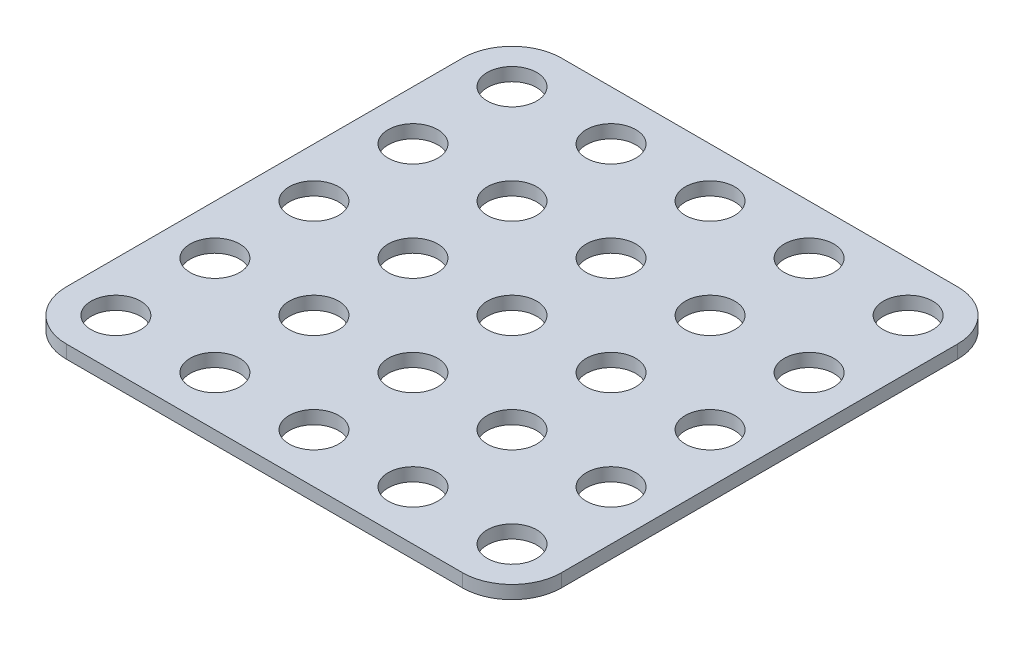
ISO-10303-21;
HEADER;
FILE_DESCRIPTION(('STEP AP214'),'2;1');
FILE_NAME('part.step','',(''),(''),'','','');
FILE_SCHEMA(('AUTOMOTIVE_DESIGN { 1 0 10303 214 1 1 1 1 }'));
ENDSEC;
DATA;
#1=APPLICATION_CONTEXT('core data for automotive mechanical design processes');
#2=APPLICATION_PROTOCOL_DEFINITION('international standard','automotive_design',2000,#1);
#3=PRODUCT_CONTEXT('',#1,'mechanical');
#4=PRODUCT('Part','Part','',(#3));
#5=PRODUCT_RELATED_PRODUCT_CATEGORY('part','',(#4));
#6=PRODUCT_DEFINITION_FORMATION('','',#4);
#7=PRODUCT_DEFINITION_CONTEXT('part definition',#1,'design');
#8=PRODUCT_DEFINITION('design','',#6,#7);
#9=PRODUCT_DEFINITION_SHAPE('','',#8);
#10=(LENGTH_UNIT() NAMED_UNIT(*) SI_UNIT(.MILLI.,.METRE.));
#11=(NAMED_UNIT(*) PLANE_ANGLE_UNIT() SI_UNIT($,.RADIAN.));
#12=(NAMED_UNIT(*) SI_UNIT($,.STERADIAN.) SOLID_ANGLE_UNIT());
#13=UNCERTAINTY_MEASURE_WITH_UNIT(LENGTH_MEASURE(1.E-05),#10,'distance_accuracy_value','');
#14=(GEOMETRIC_REPRESENTATION_CONTEXT(3) GLOBAL_UNCERTAINTY_ASSIGNED_CONTEXT((#13)) GLOBAL_UNIT_ASSIGNED_CONTEXT((#10,
#11,#12)) REPRESENTATION_CONTEXT('',''));
#15=CARTESIAN_POINT('',(0.,0.,0.));
#16=DIRECTION('',(0.,0.,1.));
#17=DIRECTION('',(1.,0.,0.));
#18=AXIS2_PLACEMENT_3D('',#15,#16,#17);
#19=CARTESIAN_POINT('',(75.,4.,0.));
#20=DIRECTION('',(-1.,0.,0.));
#21=DIRECTION('',(0.,0.,1.));
#22=AXIS2_PLACEMENT_3D('',#19,#20,#21);
#23=PLANE('',#22);
#24=DIRECTION('',(0.,0.,-1.));
#25=VECTOR('',#24,1.);
#26=CARTESIAN_POINT('',(75.,0.,0.));
#27=LINE('',#26,#25);
#28=CARTESIAN_POINT('',(75.,0.,60.));
#29=VERTEX_POINT('',#28);
#30=CARTESIAN_POINT('',(75.,0.,-60.));
#31=VERTEX_POINT('',#30);
#32=EDGE_CURVE('E248',#29,#31,#27,.T.);
#33=ORIENTED_EDGE('',*,*,#32,.T.);
#34=DIRECTION('',(0.,-1.,0.));
#35=VECTOR('',#34,1.);
#36=CARTESIAN_POINT('',(75.,4.,-60.));
#37=LINE('',#36,#35);
#38=CARTESIAN_POINT('',(75.,4.,-60.));
#39=VERTEX_POINT('',#38);
#40=EDGE_CURVE('E11',#39,#31,#37,.T.);
#41=ORIENTED_EDGE('',*,*,#40,.F.);
#42=DIRECTION('',(0.,0.,-1.));
#43=VECTOR('',#42,1.);
#44=CARTESIAN_POINT('',(75.,4.,0.));
#45=LINE('',#44,#43);
#46=CARTESIAN_POINT('',(75.,4.,60.));
#47=VERTEX_POINT('',#46);
#48=EDGE_CURVE('E310',#47,#39,#45,.T.);
#49=ORIENTED_EDGE('',*,*,#48,.F.);
#50=DIRECTION('',(0.,-1.,0.));
#51=VECTOR('',#50,1.);
#52=CARTESIAN_POINT('',(75.,4.,60.));
#53=LINE('',#52,#51);
#54=EDGE_CURVE('E63',#47,#29,#53,.T.);
#55=ORIENTED_EDGE('',*,*,#54,.T.);
#56=EDGE_LOOP('',(#33,#41,#49,#55));
#57=FACE_BOUND('',#56,.T.);
#58=ADVANCED_FACE('F45',(#57),#23,.F.);
#59=CARTESIAN_POINT('',(60.,4.,-60.));
#60=DIRECTION('',(0.,-1.,0.));
#61=DIRECTION('',(0.,0.,-1.));
#62=AXIS2_PLACEMENT_3D('',#59,#60,#61);
#63=CYLINDRICAL_SURFACE('',#62,15.);
#64=CARTESIAN_POINT('',(60.,0.,-60.));
#65=DIRECTION('',(0.,1.,0.));
#66=DIRECTION('',(0.,0.,1.));
#67=AXIS2_PLACEMENT_3D('',#64,#65,#66);
#68=CIRCLE('',#67,15.);
#69=CARTESIAN_POINT('',(60.,0.,-75.));
#70=VERTEX_POINT('',#69);
#71=EDGE_CURVE('E251',#31,#70,#68,.T.);
#72=ORIENTED_EDGE('',*,*,#71,.T.);
#73=DIRECTION('',(0.,-1.,0.));
#74=VECTOR('',#73,1.);
#75=CARTESIAN_POINT('',(60.,4.,-75.));
#76=LINE('',#75,#74);
#77=CARTESIAN_POINT('',(60.,4.,-75.));
#78=VERTEX_POINT('',#77);
#79=EDGE_CURVE('E55',#78,#70,#76,.T.);
#80=ORIENTED_EDGE('',*,*,#79,.F.);
#81=CARTESIAN_POINT('',(60.,4.,-60.));
#82=DIRECTION('',(0.,1.,0.));
#83=DIRECTION('',(0.,0.,1.));
#84=AXIS2_PLACEMENT_3D('',#81,#82,#83);
#85=CIRCLE('',#84,15.);
#86=EDGE_CURVE('E102',#39,#78,#85,.T.);
#87=ORIENTED_EDGE('',*,*,#86,.F.);
#88=ORIENTED_EDGE('',*,*,#40,.T.);
#89=EDGE_LOOP('',(#72,#80,#87,#88));
#90=FACE_BOUND('',#89,.T.);
#91=ADVANCED_FACE('F295',(#90),#63,.T.);
#92=CARTESIAN_POINT('',(0.,4.,-75.));
#93=DIRECTION('',(0.,0.,-1.));
#94=DIRECTION('',(-1.,0.,0.));
#95=AXIS2_PLACEMENT_3D('',#92,#93,#94);
#96=PLANE('',#95);
#97=DIRECTION('',(1.,0.,0.));
#98=VECTOR('',#97,1.);
#99=CARTESIAN_POINT('',(0.,0.,-75.));
#100=LINE('',#99,#98);
#101=CARTESIAN_POINT('',(-60.,0.,-75.));
#102=VERTEX_POINT('',#101);
#103=EDGE_CURVE('E255',#102,#70,#100,.T.);
#104=ORIENTED_EDGE('',*,*,#103,.F.);
#105=DIRECTION('',(0.,-1.,0.));
#106=VECTOR('',#105,1.);
#107=CARTESIAN_POINT('',(-60.,4.,-75.));
#108=LINE('',#107,#106);
#109=CARTESIAN_POINT('',(-60.,4.,-75.));
#110=VERTEX_POINT('',#109);
#111=EDGE_CURVE('E286',#110,#102,#108,.T.);
#112=ORIENTED_EDGE('',*,*,#111,.F.);
#113=DIRECTION('',(1.,0.,0.));
#114=VECTOR('',#113,1.);
#115=CARTESIAN_POINT('',(0.,4.,-75.));
#116=LINE('',#115,#114);
#117=EDGE_CURVE('E294',#110,#78,#116,.T.);
#118=ORIENTED_EDGE('',*,*,#117,.T.);
#119=ORIENTED_EDGE('',*,*,#79,.T.);
#120=EDGE_LOOP('',(#104,#112,#118,#119));
#121=FACE_BOUND('',#120,.T.);
#122=ADVANCED_FACE('F292',(#121),#96,.T.);
#123=CARTESIAN_POINT('',(-60.,4.,-60.));
#124=DIRECTION('',(0.,-1.,0.));
#125=DIRECTION('',(0.,0.,-1.));
#126=AXIS2_PLACEMENT_3D('',#123,#124,#125);
#127=CYLINDRICAL_SURFACE('',#126,15.);
#128=CARTESIAN_POINT('',(-60.,0.,-60.));
#129=DIRECTION('',(0.,1.,0.));
#130=DIRECTION('',(0.,0.,1.));
#131=AXIS2_PLACEMENT_3D('',#128,#129,#130);
#132=CIRCLE('',#131,15.);
#133=CARTESIAN_POINT('',(-75.,0.,-60.));
#134=VERTEX_POINT('',#133);
#135=EDGE_CURVE('E259',#134,#102,#132,.F.);
#136=ORIENTED_EDGE('',*,*,#135,.F.);
#137=DIRECTION('',(0.,-1.,0.));
#138=VECTOR('',#137,1.);
#139=CARTESIAN_POINT('',(-75.,4.,-60.));
#140=LINE('',#139,#138);
#141=CARTESIAN_POINT('',(-75.,4.,-60.));
#142=VERTEX_POINT('',#141);
#143=EDGE_CURVE('E283',#142,#134,#140,.T.);
#144=ORIENTED_EDGE('',*,*,#143,.F.);
#145=CARTESIAN_POINT('',(-60.,4.,-60.));
#146=DIRECTION('',(0.,1.,0.));
#147=DIRECTION('',(0.,0.,1.));
#148=AXIS2_PLACEMENT_3D('',#145,#146,#147);
#149=CIRCLE('',#148,15.);
#150=EDGE_CURVE('E304',#142,#110,#149,.F.);
#151=ORIENTED_EDGE('',*,*,#150,.T.);
#152=ORIENTED_EDGE('',*,*,#111,.T.);
#153=EDGE_LOOP('',(#136,#144,#151,#152));
#154=FACE_BOUND('',#153,.T.);
#155=ADVANCED_FACE('F302',(#154),#127,.T.);
#156=CARTESIAN_POINT('',(-75.,4.,0.));
#157=DIRECTION('',(-1.,0.,0.));
#158=DIRECTION('',(0.,0.,1.));
#159=AXIS2_PLACEMENT_3D('',#156,#157,#158);
#160=PLANE('',#159);
#161=DIRECTION('',(0.,0.,-1.));
#162=VECTOR('',#161,1.);
#163=CARTESIAN_POINT('',(-75.,0.,0.));
#164=LINE('',#163,#162);
#165=CARTESIAN_POINT('',(-75.,0.,60.));
#166=VERTEX_POINT('',#165);
#167=EDGE_CURVE('E263',#166,#134,#164,.T.);
#168=ORIENTED_EDGE('',*,*,#167,.F.);
#169=DIRECTION('',(0.,-1.,0.));
#170=VECTOR('',#169,1.);
#171=CARTESIAN_POINT('',(-75.,4.,60.));
#172=LINE('',#171,#170);
#173=CARTESIAN_POINT('',(-75.,4.,60.));
#174=VERTEX_POINT('',#173);
#175=EDGE_CURVE('E138',#174,#166,#172,.T.);
#176=ORIENTED_EDGE('',*,*,#175,.F.);
#177=DIRECTION('',(0.,0.,-1.));
#178=VECTOR('',#177,1.);
#179=CARTESIAN_POINT('',(-75.,4.,0.));
#180=LINE('',#179,#178);
#181=EDGE_CURVE('E126',#174,#142,#180,.T.);
#182=ORIENTED_EDGE('',*,*,#181,.T.);
#183=ORIENTED_EDGE('',*,*,#143,.T.);
#184=EDGE_LOOP('',(#168,#176,#182,#183));
#185=FACE_BOUND('',#184,.T.);
#186=ADVANCED_FACE('F315',(#185),#160,.T.);
#187=CARTESIAN_POINT('',(-60.,4.,60.));
#188=DIRECTION('',(0.,-1.,0.));
#189=DIRECTION('',(0.,0.,-1.));
#190=AXIS2_PLACEMENT_3D('',#187,#188,#189);
#191=CYLINDRICAL_SURFACE('',#190,15.);
#192=CARTESIAN_POINT('',(-60.,0.,60.));
#193=DIRECTION('',(0.,1.,0.));
#194=DIRECTION('',(0.,0.,1.));
#195=AXIS2_PLACEMENT_3D('',#192,#193,#194);
#196=CIRCLE('',#195,15.);
#197=CARTESIAN_POINT('',(-60.,0.,75.));
#198=VERTEX_POINT('',#197);
#199=EDGE_CURVE('E134',#166,#198,#196,.T.);
#200=ORIENTED_EDGE('',*,*,#199,.T.);
#201=DIRECTION('',(0.,-1.,0.));
#202=VECTOR('',#201,1.);
#203=CARTESIAN_POINT('',(-60.,4.,75.));
#204=LINE('',#203,#202);
#205=CARTESIAN_POINT('',(-60.,4.,75.));
#206=VERTEX_POINT('',#205);
#207=EDGE_CURVE('E131',#206,#198,#204,.T.);
#208=ORIENTED_EDGE('',*,*,#207,.F.);
#209=CARTESIAN_POINT('',(-60.,4.,60.));
#210=DIRECTION('',(0.,1.,0.));
#211=DIRECTION('',(0.,0.,1.));
#212=AXIS2_PLACEMENT_3D('',#209,#210,#211);
#213=CIRCLE('',#212,15.);
#214=EDGE_CURVE('E118',#174,#206,#213,.T.);
#215=ORIENTED_EDGE('',*,*,#214,.F.);
#216=ORIENTED_EDGE('',*,*,#175,.T.);
#217=EDGE_LOOP('',(#200,#208,#215,#216));
#218=FACE_BOUND('',#217,.T.);
#219=ADVANCED_FACE('F132',(#218),#191,.T.);
#220=CARTESIAN_POINT('',(0.,4.,75.));
#221=DIRECTION('',(0.,0.,-1.));
#222=DIRECTION('',(-1.,0.,0.));
#223=AXIS2_PLACEMENT_3D('',#220,#221,#222);
#224=PLANE('',#223);
#225=DIRECTION('',(1.,0.,0.));
#226=VECTOR('',#225,1.);
#227=CARTESIAN_POINT('',(0.,0.,75.));
#228=LINE('',#227,#226);
#229=CARTESIAN_POINT('',(60.,0.,75.));
#230=VERTEX_POINT('',#229);
#231=EDGE_CURVE('E269',#198,#230,#228,.T.);
#232=ORIENTED_EDGE('',*,*,#231,.T.);
#233=DIRECTION('',(0.,-1.,0.));
#234=VECTOR('',#233,1.);
#235=CARTESIAN_POINT('',(60.,4.,75.));
#236=LINE('',#235,#234);
#237=CARTESIAN_POINT('',(60.,4.,75.));
#238=VERTEX_POINT('',#237);
#239=EDGE_CURVE('E90',#238,#230,#236,.T.);
#240=ORIENTED_EDGE('',*,*,#239,.F.);
#241=DIRECTION('',(1.,0.,0.));
#242=VECTOR('',#241,1.);
#243=CARTESIAN_POINT('',(0.,4.,75.));
#244=LINE('',#243,#242);
#245=EDGE_CURVE('E123',#206,#238,#244,.T.);
#246=ORIENTED_EDGE('',*,*,#245,.F.);
#247=ORIENTED_EDGE('',*,*,#207,.T.);
#248=EDGE_LOOP('',(#232,#240,#246,#247));
#249=FACE_BOUND('',#248,.T.);
#250=ADVANCED_FACE('F140',(#249),#224,.F.);
#251=CARTESIAN_POINT('',(-60.,4.,60.));
#252=DIRECTION('',(0.,-1.,0.));
#253=DIRECTION('',(0.,0.,-1.));
#254=AXIS2_PLACEMENT_3D('',#251,#252,#253);
#255=CYLINDRICAL_SURFACE('',#254,7.5);
#256=CARTESIAN_POINT('',(-60.,4.,60.));
#257=DIRECTION('',(0.,1.,0.));
#258=DIRECTION('',(0.,0.,1.));
#259=AXIS2_PLACEMENT_3D('',#256,#257,#258);
#260=CIRCLE('',#259,7.5);
#261=CARTESIAN_POINT('',(-60.,4.,67.5));
#262=VERTEX_POINT('',#261);
#263=EDGE_CURVE('E818',#262,#262,#260,.T.);
#264=ORIENTED_EDGE('',*,*,#263,.T.);
#265=EDGE_LOOP('',(#264));
#266=FACE_BOUND('',#265,.T.);
#267=CARTESIAN_POINT('',(-60.,0.,60.));
#268=DIRECTION('',(0.,1.,0.));
#269=DIRECTION('',(0.,0.,1.));
#270=AXIS2_PLACEMENT_3D('',#267,#268,#269);
#271=CIRCLE('',#270,7.5);
#272=CARTESIAN_POINT('',(-60.,0.,67.5));
#273=VERTEX_POINT('',#272);
#274=EDGE_CURVE('E244',#273,#273,#271,.T.);
#275=ORIENTED_EDGE('',*,*,#274,.F.);
#276=EDGE_LOOP('',(#275));
#277=FACE_BOUND('',#276,.T.);
#278=ADVANCED_FACE('F337',(#266,#277),#255,.F.);
#279=CARTESIAN_POINT('',(-30.,4.,60.));
#280=DIRECTION('',(0.,-1.,0.));
#281=DIRECTION('',(0.,0.,-1.));
#282=AXIS2_PLACEMENT_3D('',#279,#280,#281);
#283=CYLINDRICAL_SURFACE('',#282,7.5);
#284=CARTESIAN_POINT('',(-30.,4.,60.));
#285=DIRECTION('',(0.,1.,0.));
#286=DIRECTION('',(0.,0.,1.));
#287=AXIS2_PLACEMENT_3D('',#284,#285,#286);
#288=CIRCLE('',#287,7.5);
#289=CARTESIAN_POINT('',(-30.,4.,67.5));
#290=VERTEX_POINT('',#289);
#291=EDGE_CURVE('E814',#290,#290,#288,.T.);
#292=ORIENTED_EDGE('',*,*,#291,.T.);
#293=EDGE_LOOP('',(#292));
#294=FACE_BOUND('',#293,.T.);
#295=CARTESIAN_POINT('',(-30.,0.,60.));
#296=DIRECTION('',(0.,1.,0.));
#297=DIRECTION('',(0.,0.,1.));
#298=AXIS2_PLACEMENT_3D('',#295,#296,#297);
#299=CIRCLE('',#298,7.5);
#300=CARTESIAN_POINT('',(-30.,0.,67.5));
#301=VERTEX_POINT('',#300);
#302=EDGE_CURVE('E240',#301,#301,#299,.T.);
#303=ORIENTED_EDGE('',*,*,#302,.F.);
#304=EDGE_LOOP('',(#303));
#305=FACE_BOUND('',#304,.T.);
#306=ADVANCED_FACE('F340',(#294,#305),#283,.F.);
#307=CARTESIAN_POINT('',(0.,4.,60.));
#308=DIRECTION('',(0.,-1.,0.));
#309=DIRECTION('',(0.,0.,-1.));
#310=AXIS2_PLACEMENT_3D('',#307,#308,#309);
#311=CYLINDRICAL_SURFACE('',#310,7.5);
#312=CARTESIAN_POINT('',(0.,4.,60.));
#313=DIRECTION('',(0.,1.,0.));
#314=DIRECTION('',(0.,0.,1.));
#315=AXIS2_PLACEMENT_3D('',#312,#313,#314);
#316=CIRCLE('',#315,7.5);
#317=CARTESIAN_POINT('',(0.,4.,67.5));
#318=VERTEX_POINT('',#317);
#319=EDGE_CURVE('E810',#318,#318,#316,.T.);
#320=ORIENTED_EDGE('',*,*,#319,.T.);
#321=EDGE_LOOP('',(#320));
#322=FACE_BOUND('',#321,.T.);
#323=CARTESIAN_POINT('',(0.,0.,60.));
#324=DIRECTION('',(0.,1.,0.));
#325=DIRECTION('',(0.,0.,1.));
#326=AXIS2_PLACEMENT_3D('',#323,#324,#325);
#327=CIRCLE('',#326,7.5);
#328=CARTESIAN_POINT('',(0.,0.,67.5));
#329=VERTEX_POINT('',#328);
#330=EDGE_CURVE('E236',#329,#329,#327,.T.);
#331=ORIENTED_EDGE('',*,*,#330,.F.);
#332=EDGE_LOOP('',(#331));
#333=FACE_BOUND('',#332,.T.);
#334=ADVANCED_FACE('F344',(#322,#333),#311,.F.);
#335=CARTESIAN_POINT('',(30.,4.,60.));
#336=DIRECTION('',(0.,-1.,0.));
#337=DIRECTION('',(0.,0.,-1.));
#338=AXIS2_PLACEMENT_3D('',#335,#336,#337);
#339=CYLINDRICAL_SURFACE('',#338,7.5);
#340=CARTESIAN_POINT('',(30.,4.,60.));
#341=DIRECTION('',(0.,1.,0.));
#342=DIRECTION('',(0.,0.,1.));
#343=AXIS2_PLACEMENT_3D('',#340,#341,#342);
#344=CIRCLE('',#343,7.5);
#345=CARTESIAN_POINT('',(30.,4.,67.5));
#346=VERTEX_POINT('',#345);
#347=EDGE_CURVE('E806',#346,#346,#344,.T.);
#348=ORIENTED_EDGE('',*,*,#347,.T.);
#349=EDGE_LOOP('',(#348));
#350=FACE_BOUND('',#349,.T.);
#351=CARTESIAN_POINT('',(30.,0.,60.));
#352=DIRECTION('',(0.,1.,0.));
#353=DIRECTION('',(0.,0.,1.));
#354=AXIS2_PLACEMENT_3D('',#351,#352,#353);
#355=CIRCLE('',#354,7.5);
#356=CARTESIAN_POINT('',(30.,0.,67.5));
#357=VERTEX_POINT('',#356);
#358=EDGE_CURVE('E232',#357,#357,#355,.T.);
#359=ORIENTED_EDGE('',*,*,#358,.F.);
#360=EDGE_LOOP('',(#359));
#361=FACE_BOUND('',#360,.T.);
#362=ADVANCED_FACE('F348',(#350,#361),#339,.F.);
#363=CARTESIAN_POINT('',(60.,4.,60.));
#364=DIRECTION('',(0.,-1.,0.));
#365=DIRECTION('',(0.,0.,-1.));
#366=AXIS2_PLACEMENT_3D('',#363,#364,#365);
#367=CYLINDRICAL_SURFACE('',#366,7.5);
#368=CARTESIAN_POINT('',(60.,4.,60.));
#369=DIRECTION('',(0.,1.,0.));
#370=DIRECTION('',(0.,0.,1.));
#371=AXIS2_PLACEMENT_3D('',#368,#369,#370);
#372=CIRCLE('',#371,7.5);
#373=CARTESIAN_POINT('',(60.,4.,67.5));
#374=VERTEX_POINT('',#373);
#375=EDGE_CURVE('E802',#374,#374,#372,.T.);
#376=ORIENTED_EDGE('',*,*,#375,.T.);
#377=EDGE_LOOP('',(#376));
#378=FACE_BOUND('',#377,.T.);
#379=CARTESIAN_POINT('',(60.,0.,60.));
#380=DIRECTION('',(0.,1.,0.));
#381=DIRECTION('',(0.,0.,1.));
#382=AXIS2_PLACEMENT_3D('',#379,#380,#381);
#383=CIRCLE('',#382,7.5);
#384=CARTESIAN_POINT('',(60.,0.,67.5));
#385=VERTEX_POINT('',#384);
#386=EDGE_CURVE('E228',#385,#385,#383,.T.);
#387=ORIENTED_EDGE('',*,*,#386,.F.);
#388=EDGE_LOOP('',(#387));
#389=FACE_BOUND('',#388,.T.);
#390=ADVANCED_FACE('F352',(#378,#389),#367,.F.);
#391=CARTESIAN_POINT('',(-30.0000000000001,4.,30.));
#392=DIRECTION('',(0.,-1.,0.));
#393=DIRECTION('',(0.,0.,-1.));
#394=AXIS2_PLACEMENT_3D('',#391,#392,#393);
#395=CYLINDRICAL_SURFACE('',#394,7.5);
#396=CARTESIAN_POINT('',(-30.0000000000001,4.,30.));
#397=DIRECTION('',(0.,1.,0.));
#398=DIRECTION('',(0.,0.,1.));
#399=AXIS2_PLACEMENT_3D('',#396,#397,#398);
#400=CIRCLE('',#399,7.5);
#401=CARTESIAN_POINT('',(-30.0000000000001,4.,37.5));
#402=VERTEX_POINT('',#401);
#403=EDGE_CURVE('E798',#402,#402,#400,.T.);
#404=ORIENTED_EDGE('',*,*,#403,.T.);
#405=EDGE_LOOP('',(#404));
#406=FACE_BOUND('',#405,.T.);
#407=CARTESIAN_POINT('',(-30.0000000000001,0.,30.));
#408=DIRECTION('',(0.,1.,0.));
#409=DIRECTION('',(0.,0.,1.));
#410=AXIS2_PLACEMENT_3D('',#407,#408,#409);
#411=CIRCLE('',#410,7.5);
#412=CARTESIAN_POINT('',(-30.0000000000001,0.,37.5));
#413=VERTEX_POINT('',#412);
#414=EDGE_CURVE('E224',#413,#413,#411,.T.);
#415=ORIENTED_EDGE('',*,*,#414,.F.);
#416=EDGE_LOOP('',(#415));
#417=FACE_BOUND('',#416,.T.);
#418=ADVANCED_FACE('F356',(#406,#417),#395,.F.);
#419=CARTESIAN_POINT('',(0.,4.,30.));
#420=DIRECTION('',(0.,-1.,0.));
#421=DIRECTION('',(0.,0.,-1.));
#422=AXIS2_PLACEMENT_3D('',#419,#420,#421);
#423=CYLINDRICAL_SURFACE('',#422,7.5);
#424=CARTESIAN_POINT('',(0.,4.,30.));
#425=DIRECTION('',(0.,1.,0.));
#426=DIRECTION('',(0.,0.,1.));
#427=AXIS2_PLACEMENT_3D('',#424,#425,#426);
#428=CIRCLE('',#427,7.5);
#429=CARTESIAN_POINT('',(0.,4.,37.5));
#430=VERTEX_POINT('',#429);
#431=EDGE_CURVE('E794',#430,#430,#428,.T.);
#432=ORIENTED_EDGE('',*,*,#431,.T.);
#433=EDGE_LOOP('',(#432));
#434=FACE_BOUND('',#433,.T.);
#435=CARTESIAN_POINT('',(0.,0.,30.));
#436=DIRECTION('',(0.,1.,0.));
#437=DIRECTION('',(0.,0.,1.));
#438=AXIS2_PLACEMENT_3D('',#435,#436,#437);
#439=CIRCLE('',#438,7.5);
#440=CARTESIAN_POINT('',(0.,0.,37.5));
#441=VERTEX_POINT('',#440);
#442=EDGE_CURVE('E220',#441,#441,#439,.T.);
#443=ORIENTED_EDGE('',*,*,#442,.F.);
#444=EDGE_LOOP('',(#443));
#445=FACE_BOUND('',#444,.T.);
#446=ADVANCED_FACE('F360',(#434,#445),#423,.F.);
#447=CARTESIAN_POINT('',(29.9999999999999,4.,30.));
#448=DIRECTION('',(0.,-1.,0.));
#449=DIRECTION('',(0.,0.,-1.));
#450=AXIS2_PLACEMENT_3D('',#447,#448,#449);
#451=CYLINDRICAL_SURFACE('',#450,7.5);
#452=CARTESIAN_POINT('',(29.9999999999999,4.,30.));
#453=DIRECTION('',(0.,1.,0.));
#454=DIRECTION('',(0.,0.,1.));
#455=AXIS2_PLACEMENT_3D('',#452,#453,#454);
#456=CIRCLE('',#455,7.5);
#457=CARTESIAN_POINT('',(29.9999999999999,4.,37.5));
#458=VERTEX_POINT('',#457);
#459=EDGE_CURVE('E790',#458,#458,#456,.T.);
#460=ORIENTED_EDGE('',*,*,#459,.T.);
#461=EDGE_LOOP('',(#460));
#462=FACE_BOUND('',#461,.T.);
#463=CARTESIAN_POINT('',(29.9999999999999,0.,30.));
#464=DIRECTION('',(0.,1.,0.));
#465=DIRECTION('',(0.,0.,1.));
#466=AXIS2_PLACEMENT_3D('',#463,#464,#465);
#467=CIRCLE('',#466,7.5);
#468=CARTESIAN_POINT('',(29.9999999999999,0.,37.5));
#469=VERTEX_POINT('',#468);
#470=EDGE_CURVE('E216',#469,#469,#467,.T.);
#471=ORIENTED_EDGE('',*,*,#470,.F.);
#472=EDGE_LOOP('',(#471));
#473=FACE_BOUND('',#472,.T.);
#474=ADVANCED_FACE('F364',(#462,#473),#451,.F.);
#475=CARTESIAN_POINT('',(59.9999999999999,4.,30.));
#476=DIRECTION('',(0.,-1.,0.));
#477=DIRECTION('',(0.,0.,-1.));
#478=AXIS2_PLACEMENT_3D('',#475,#476,#477);
#479=CYLINDRICAL_SURFACE('',#478,7.5);
#480=CARTESIAN_POINT('',(59.9999999999999,4.,30.));
#481=DIRECTION('',(0.,1.,0.));
#482=DIRECTION('',(0.,0.,1.));
#483=AXIS2_PLACEMENT_3D('',#480,#481,#482);
#484=CIRCLE('',#483,7.5);
#485=CARTESIAN_POINT('',(59.9999999999999,4.,37.5));
#486=VERTEX_POINT('',#485);
#487=EDGE_CURVE('E786',#486,#486,#484,.T.);
#488=ORIENTED_EDGE('',*,*,#487,.T.);
#489=EDGE_LOOP('',(#488));
#490=FACE_BOUND('',#489,.T.);
#491=CARTESIAN_POINT('',(59.9999999999999,0.,30.));
#492=DIRECTION('',(0.,1.,0.));
#493=DIRECTION('',(0.,0.,1.));
#494=AXIS2_PLACEMENT_3D('',#491,#492,#493);
#495=CIRCLE('',#494,7.5);
#496=CARTESIAN_POINT('',(59.9999999999999,0.,37.5));
#497=VERTEX_POINT('',#496);
#498=EDGE_CURVE('E212',#497,#497,#495,.T.);
#499=ORIENTED_EDGE('',*,*,#498,.F.);
#500=EDGE_LOOP('',(#499));
#501=FACE_BOUND('',#500,.T.);
#502=ADVANCED_FACE('F368',(#490,#501),#479,.F.);
#503=CARTESIAN_POINT('',(-30.0000000000002,4.,0.));
#504=DIRECTION('',(0.,-1.,0.));
#505=DIRECTION('',(0.,0.,-1.));
#506=AXIS2_PLACEMENT_3D('',#503,#504,#505);
#507=CYLINDRICAL_SURFACE('',#506,7.5);
#508=CARTESIAN_POINT('',(-30.0000000000002,4.,0.));
#509=DIRECTION('',(0.,1.,0.));
#510=DIRECTION('',(0.,0.,1.));
#511=AXIS2_PLACEMENT_3D('',#508,#509,#510);
#512=CIRCLE('',#511,7.5);
#513=CARTESIAN_POINT('',(-30.0000000000002,4.,7.49999999999999));
#514=VERTEX_POINT('',#513);
#515=EDGE_CURVE('E782',#514,#514,#512,.T.);
#516=ORIENTED_EDGE('',*,*,#515,.T.);
#517=EDGE_LOOP('',(#516));
#518=FACE_BOUND('',#517,.T.);
#519=CARTESIAN_POINT('',(-30.0000000000002,0.,0.));
#520=DIRECTION('',(0.,1.,0.));
#521=DIRECTION('',(0.,0.,1.));
#522=AXIS2_PLACEMENT_3D('',#519,#520,#521);
#523=CIRCLE('',#522,7.5);
#524=CARTESIAN_POINT('',(-30.0000000000002,0.,7.49999999999999));
#525=VERTEX_POINT('',#524);
#526=EDGE_CURVE('E208',#525,#525,#523,.T.);
#527=ORIENTED_EDGE('',*,*,#526,.F.);
#528=EDGE_LOOP('',(#527));
#529=FACE_BOUND('',#528,.T.);
#530=ADVANCED_FACE('F372',(#518,#529),#507,.F.);
#531=CARTESIAN_POINT('',(-1.94289029309402E-13,4.,0.));
#532=DIRECTION('',(0.,-1.,0.));
#533=DIRECTION('',(0.,0.,-1.));
#534=AXIS2_PLACEMENT_3D('',#531,#532,#533);
#535=CYLINDRICAL_SURFACE('',#534,7.5);
#536=CARTESIAN_POINT('',(-1.94289029309402E-13,4.,0.));
#537=DIRECTION('',(0.,1.,0.));
#538=DIRECTION('',(0.,0.,1.));
#539=AXIS2_PLACEMENT_3D('',#536,#537,#538);
#540=CIRCLE('',#539,7.5);
#541=CARTESIAN_POINT('',(-1.94289029309402E-13,4.,7.49999999999999));
#542=VERTEX_POINT('',#541);
#543=EDGE_CURVE('E778',#542,#542,#540,.T.);
#544=ORIENTED_EDGE('',*,*,#543,.T.);
#545=EDGE_LOOP('',(#544));
#546=FACE_BOUND('',#545,.T.);
#547=CARTESIAN_POINT('',(-1.94289029309402E-13,0.,0.));
#548=DIRECTION('',(0.,1.,0.));
#549=DIRECTION('',(0.,0.,1.));
#550=AXIS2_PLACEMENT_3D('',#547,#548,#549);
#551=CIRCLE('',#550,7.5);
#552=CARTESIAN_POINT('',(-1.94289029309402E-13,0.,7.49999999999999));
#553=VERTEX_POINT('',#552);
#554=EDGE_CURVE('E204',#553,#553,#551,.T.);
#555=ORIENTED_EDGE('',*,*,#554,.F.);
#556=EDGE_LOOP('',(#555));
#557=FACE_BOUND('',#556,.T.);
#558=ADVANCED_FACE('F376',(#546,#557),#535,.F.);
#559=CARTESIAN_POINT('',(29.9999999999998,4.,0.));
#560=DIRECTION('',(0.,-1.,0.));
#561=DIRECTION('',(0.,0.,-1.));
#562=AXIS2_PLACEMENT_3D('',#559,#560,#561);
#563=CYLINDRICAL_SURFACE('',#562,7.5);
#564=CARTESIAN_POINT('',(29.9999999999998,4.,0.));
#565=DIRECTION('',(0.,1.,0.));
#566=DIRECTION('',(0.,0.,1.));
#567=AXIS2_PLACEMENT_3D('',#564,#565,#566);
#568=CIRCLE('',#567,7.5);
#569=CARTESIAN_POINT('',(29.9999999999998,4.,7.49999999999999));
#570=VERTEX_POINT('',#569);
#571=EDGE_CURVE('E774',#570,#570,#568,.T.);
#572=ORIENTED_EDGE('',*,*,#571,.T.);
#573=EDGE_LOOP('',(#572));
#574=FACE_BOUND('',#573,.T.);
#575=CARTESIAN_POINT('',(29.9999999999998,0.,0.));
#576=DIRECTION('',(0.,1.,0.));
#577=DIRECTION('',(0.,0.,1.));
#578=AXIS2_PLACEMENT_3D('',#575,#576,#577);
#579=CIRCLE('',#578,7.5);
#580=CARTESIAN_POINT('',(29.9999999999998,0.,7.49999999999999));
#581=VERTEX_POINT('',#580);
#582=EDGE_CURVE('E200',#581,#581,#579,.T.);
#583=ORIENTED_EDGE('',*,*,#582,.F.);
#584=EDGE_LOOP('',(#583));
#585=FACE_BOUND('',#584,.T.);
#586=ADVANCED_FACE('F380',(#574,#585),#563,.F.);
#587=CARTESIAN_POINT('',(59.9999999999998,4.,0.));
#588=DIRECTION('',(0.,-1.,0.));
#589=DIRECTION('',(0.,0.,-1.));
#590=AXIS2_PLACEMENT_3D('',#587,#588,#589);
#591=CYLINDRICAL_SURFACE('',#590,7.5);
#592=CARTESIAN_POINT('',(59.9999999999998,4.,0.));
#593=DIRECTION('',(0.,1.,0.));
#594=DIRECTION('',(0.,0.,1.));
#595=AXIS2_PLACEMENT_3D('',#592,#593,#594);
#596=CIRCLE('',#595,7.5);
#597=CARTESIAN_POINT('',(59.9999999999998,4.,7.49999999999999));
#598=VERTEX_POINT('',#597);
#599=EDGE_CURVE('E770',#598,#598,#596,.T.);
#600=ORIENTED_EDGE('',*,*,#599,.T.);
#601=EDGE_LOOP('',(#600));
#602=FACE_BOUND('',#601,.T.);
#603=CARTESIAN_POINT('',(59.9999999999998,0.,0.));
#604=DIRECTION('',(0.,1.,0.));
#605=DIRECTION('',(0.,0.,1.));
#606=AXIS2_PLACEMENT_3D('',#603,#604,#605);
#607=CIRCLE('',#606,7.5);
#608=CARTESIAN_POINT('',(59.9999999999998,0.,7.49999999999999));
#609=VERTEX_POINT('',#608);
#610=EDGE_CURVE('E196',#609,#609,#607,.T.);
#611=ORIENTED_EDGE('',*,*,#610,.F.);
#612=EDGE_LOOP('',(#611));
#613=FACE_BOUND('',#612,.T.);
#614=ADVANCED_FACE('F384',(#602,#613),#591,.F.);
#615=CARTESIAN_POINT('',(-30.0000000000003,4.,-30.));
#616=DIRECTION('',(0.,-1.,0.));
#617=DIRECTION('',(0.,0.,-1.));
#618=AXIS2_PLACEMENT_3D('',#615,#616,#617);
#619=CYLINDRICAL_SURFACE('',#618,7.5);
#620=CARTESIAN_POINT('',(-30.0000000000003,4.,-30.));
#621=DIRECTION('',(0.,1.,0.));
#622=DIRECTION('',(0.,0.,1.));
#623=AXIS2_PLACEMENT_3D('',#620,#621,#622);
#624=CIRCLE('',#623,7.5);
#625=CARTESIAN_POINT('',(-30.0000000000003,4.,-22.5));
#626=VERTEX_POINT('',#625);
#627=EDGE_CURVE('E766',#626,#626,#624,.T.);
#628=ORIENTED_EDGE('',*,*,#627,.T.);
#629=EDGE_LOOP('',(#628));
#630=FACE_BOUND('',#629,.T.);
#631=CARTESIAN_POINT('',(-30.0000000000003,0.,-30.));
#632=DIRECTION('',(0.,1.,0.));
#633=DIRECTION('',(0.,0.,1.));
#634=AXIS2_PLACEMENT_3D('',#631,#632,#633);
#635=CIRCLE('',#634,7.5);
#636=CARTESIAN_POINT('',(-30.0000000000003,0.,-22.5));
#637=VERTEX_POINT('',#636);
#638=EDGE_CURVE('E192',#637,#637,#635,.T.);
#639=ORIENTED_EDGE('',*,*,#638,.F.);
#640=EDGE_LOOP('',(#639));
#641=FACE_BOUND('',#640,.T.);
#642=ADVANCED_FACE('F388',(#630,#641),#619,.F.);
#643=CARTESIAN_POINT('',(-2.91433543964104E-13,4.,-30.));
#644=DIRECTION('',(0.,-1.,0.));
#645=DIRECTION('',(0.,0.,-1.));
#646=AXIS2_PLACEMENT_3D('',#643,#644,#645);
#647=CYLINDRICAL_SURFACE('',#646,7.5);
#648=CARTESIAN_POINT('',(-2.91433543964104E-13,4.,-30.));
#649=DIRECTION('',(0.,1.,0.));
#650=DIRECTION('',(0.,0.,1.));
#651=AXIS2_PLACEMENT_3D('',#648,#649,#650);
#652=CIRCLE('',#651,7.5);
#653=CARTESIAN_POINT('',(-2.91433543964104E-13,4.,-22.5));
#654=VERTEX_POINT('',#653);
#655=EDGE_CURVE('E762',#654,#654,#652,.T.);
#656=ORIENTED_EDGE('',*,*,#655,.T.);
#657=EDGE_LOOP('',(#656));
#658=FACE_BOUND('',#657,.T.);
#659=CARTESIAN_POINT('',(-2.91433543964104E-13,0.,-30.));
#660=DIRECTION('',(0.,1.,0.));
#661=DIRECTION('',(0.,0.,1.));
#662=AXIS2_PLACEMENT_3D('',#659,#660,#661);
#663=CIRCLE('',#662,7.5);
#664=CARTESIAN_POINT('',(-2.91433543964104E-13,0.,-22.5));
#665=VERTEX_POINT('',#664);
#666=EDGE_CURVE('E188',#665,#665,#663,.T.);
#667=ORIENTED_EDGE('',*,*,#666,.F.);
#668=EDGE_LOOP('',(#667));
#669=FACE_BOUND('',#668,.T.);
#670=ADVANCED_FACE('F392',(#658,#669),#647,.F.);
#671=CARTESIAN_POINT('',(29.9999999999997,4.,-30.));
#672=DIRECTION('',(0.,-1.,0.));
#673=DIRECTION('',(0.,0.,-1.));
#674=AXIS2_PLACEMENT_3D('',#671,#672,#673);
#675=CYLINDRICAL_SURFACE('',#674,7.5);
#676=CARTESIAN_POINT('',(29.9999999999997,4.,-30.));
#677=DIRECTION('',(0.,1.,0.));
#678=DIRECTION('',(0.,0.,1.));
#679=AXIS2_PLACEMENT_3D('',#676,#677,#678);
#680=CIRCLE('',#679,7.5);
#681=CARTESIAN_POINT('',(29.9999999999997,4.,-22.5));
#682=VERTEX_POINT('',#681);
#683=EDGE_CURVE('E758',#682,#682,#680,.T.);
#684=ORIENTED_EDGE('',*,*,#683,.T.);
#685=EDGE_LOOP('',(#684));
#686=FACE_BOUND('',#685,.T.);
#687=CARTESIAN_POINT('',(29.9999999999997,0.,-30.));
#688=DIRECTION('',(0.,1.,0.));
#689=DIRECTION('',(0.,0.,1.));
#690=AXIS2_PLACEMENT_3D('',#687,#688,#689);
#691=CIRCLE('',#690,7.5);
#692=CARTESIAN_POINT('',(29.9999999999997,0.,-22.5));
#693=VERTEX_POINT('',#692);
#694=EDGE_CURVE('E184',#693,#693,#691,.T.);
#695=ORIENTED_EDGE('',*,*,#694,.F.);
#696=EDGE_LOOP('',(#695));
#697=FACE_BOUND('',#696,.T.);
#698=ADVANCED_FACE('F396',(#686,#697),#675,.F.);
#699=CARTESIAN_POINT('',(59.9999999999997,4.,-30.));
#700=DIRECTION('',(0.,-1.,0.));
#701=DIRECTION('',(0.,0.,-1.));
#702=AXIS2_PLACEMENT_3D('',#699,#700,#701);
#703=CYLINDRICAL_SURFACE('',#702,7.5);
#704=CARTESIAN_POINT('',(59.9999999999997,4.,-30.));
#705=DIRECTION('',(0.,1.,0.));
#706=DIRECTION('',(0.,0.,1.));
#707=AXIS2_PLACEMENT_3D('',#704,#705,#706);
#708=CIRCLE('',#707,7.5);
#709=CARTESIAN_POINT('',(59.9999999999997,4.,-22.5));
#710=VERTEX_POINT('',#709);
#711=EDGE_CURVE('E754',#710,#710,#708,.T.);
#712=ORIENTED_EDGE('',*,*,#711,.T.);
#713=EDGE_LOOP('',(#712));
#714=FACE_BOUND('',#713,.T.);
#715=CARTESIAN_POINT('',(59.9999999999997,0.,-30.));
#716=DIRECTION('',(0.,1.,0.));
#717=DIRECTION('',(0.,0.,1.));
#718=AXIS2_PLACEMENT_3D('',#715,#716,#717);
#719=CIRCLE('',#718,7.5);
#720=CARTESIAN_POINT('',(59.9999999999997,0.,-22.5));
#721=VERTEX_POINT('',#720);
#722=EDGE_CURVE('E180',#721,#721,#719,.T.);
#723=ORIENTED_EDGE('',*,*,#722,.F.);
#724=EDGE_LOOP('',(#723));
#725=FACE_BOUND('',#724,.T.);
#726=ADVANCED_FACE('F400',(#714,#725),#703,.F.);
#727=CARTESIAN_POINT('',(-30.0000000000004,4.,-60.));
#728=DIRECTION('',(0.,-1.,0.));
#729=DIRECTION('',(0.,0.,-1.));
#730=AXIS2_PLACEMENT_3D('',#727,#728,#729);
#731=CYLINDRICAL_SURFACE('',#730,7.5);
#732=CARTESIAN_POINT('',(-30.0000000000004,4.,-60.));
#733=DIRECTION('',(0.,1.,0.));
#734=DIRECTION('',(0.,0.,1.));
#735=AXIS2_PLACEMENT_3D('',#732,#733,#734);
#736=CIRCLE('',#735,7.5);
#737=CARTESIAN_POINT('',(-30.0000000000004,4.,-52.5));
#738=VERTEX_POINT('',#737);
#739=EDGE_CURVE('E750',#738,#738,#736,.T.);
#740=ORIENTED_EDGE('',*,*,#739,.T.);
#741=EDGE_LOOP('',(#740));
#742=FACE_BOUND('',#741,.T.);
#743=CARTESIAN_POINT('',(-30.0000000000004,0.,-60.));
#744=DIRECTION('',(0.,1.,0.));
#745=DIRECTION('',(0.,0.,1.));
#746=AXIS2_PLACEMENT_3D('',#743,#744,#745);
#747=CIRCLE('',#746,7.5);
#748=CARTESIAN_POINT('',(-30.0000000000004,0.,-52.5));
#749=VERTEX_POINT('',#748);
#750=EDGE_CURVE('E176',#749,#749,#747,.T.);
#751=ORIENTED_EDGE('',*,*,#750,.F.);
#752=EDGE_LOOP('',(#751));
#753=FACE_BOUND('',#752,.T.);
#754=ADVANCED_FACE('F404',(#742,#753),#731,.F.);
#755=CARTESIAN_POINT('',(-3.95516952522712E-13,4.,-60.));
#756=DIRECTION('',(0.,-1.,0.));
#757=DIRECTION('',(0.,0.,-1.));
#758=AXIS2_PLACEMENT_3D('',#755,#756,#757);
#759=CYLINDRICAL_SURFACE('',#758,7.5);
#760=CARTESIAN_POINT('',(-3.95516952522712E-13,4.,-60.));
#761=DIRECTION('',(0.,1.,0.));
#762=DIRECTION('',(0.,0.,1.));
#763=AXIS2_PLACEMENT_3D('',#760,#761,#762);
#764=CIRCLE('',#763,7.5);
#765=CARTESIAN_POINT('',(-3.95516952522712E-13,4.,-52.5));
#766=VERTEX_POINT('',#765);
#767=EDGE_CURVE('E746',#766,#766,#764,.T.);
#768=ORIENTED_EDGE('',*,*,#767,.T.);
#769=EDGE_LOOP('',(#768));
#770=FACE_BOUND('',#769,.T.);
#771=CARTESIAN_POINT('',(-3.95516952522712E-13,0.,-60.));
#772=DIRECTION('',(0.,1.,0.));
#773=DIRECTION('',(0.,0.,1.));
#774=AXIS2_PLACEMENT_3D('',#771,#772,#773);
#775=CIRCLE('',#774,7.5);
#776=CARTESIAN_POINT('',(-3.95516952522712E-13,0.,-52.5));
#777=VERTEX_POINT('',#776);
#778=EDGE_CURVE('E172',#777,#777,#775,.T.);
#779=ORIENTED_EDGE('',*,*,#778,.F.);
#780=EDGE_LOOP('',(#779));
#781=FACE_BOUND('',#780,.T.);
#782=ADVANCED_FACE('F408',(#770,#781),#759,.F.);
#783=CARTESIAN_POINT('',(29.9999999999996,4.,-60.));
#784=DIRECTION('',(0.,-1.,0.));
#785=DIRECTION('',(0.,0.,-1.));
#786=AXIS2_PLACEMENT_3D('',#783,#784,#785);
#787=CYLINDRICAL_SURFACE('',#786,7.5);
#788=CARTESIAN_POINT('',(29.9999999999996,4.,-60.));
#789=DIRECTION('',(0.,1.,0.));
#790=DIRECTION('',(0.,0.,1.));
#791=AXIS2_PLACEMENT_3D('',#788,#789,#790);
#792=CIRCLE('',#791,7.5);
#793=CARTESIAN_POINT('',(29.9999999999996,4.,-52.5));
#794=VERTEX_POINT('',#793);
#795=EDGE_CURVE('E742',#794,#794,#792,.T.);
#796=ORIENTED_EDGE('',*,*,#795,.T.);
#797=EDGE_LOOP('',(#796));
#798=FACE_BOUND('',#797,.T.);
#799=CARTESIAN_POINT('',(29.9999999999996,0.,-60.));
#800=DIRECTION('',(0.,1.,0.));
#801=DIRECTION('',(0.,0.,1.));
#802=AXIS2_PLACEMENT_3D('',#799,#800,#801);
#803=CIRCLE('',#802,7.5);
#804=CARTESIAN_POINT('',(29.9999999999996,0.,-52.5));
#805=VERTEX_POINT('',#804);
#806=EDGE_CURVE('E168',#805,#805,#803,.T.);
#807=ORIENTED_EDGE('',*,*,#806,.F.);
#808=EDGE_LOOP('',(#807));
#809=FACE_BOUND('',#808,.T.);
#810=ADVANCED_FACE('F412',(#798,#809),#787,.F.);
#811=CARTESIAN_POINT('',(59.9999999999996,4.,-60.));
#812=DIRECTION('',(0.,-1.,0.));
#813=DIRECTION('',(0.,0.,-1.));
#814=AXIS2_PLACEMENT_3D('',#811,#812,#813);
#815=CYLINDRICAL_SURFACE('',#814,7.5);
#816=CARTESIAN_POINT('',(59.9999999999996,4.,-60.));
#817=DIRECTION('',(0.,1.,0.));
#818=DIRECTION('',(0.,0.,1.));
#819=AXIS2_PLACEMENT_3D('',#816,#817,#818);
#820=CIRCLE('',#819,7.5);
#821=CARTESIAN_POINT('',(59.9999999999996,4.,-52.5));
#822=VERTEX_POINT('',#821);
#823=EDGE_CURVE('E738',#822,#822,#820,.T.);
#824=ORIENTED_EDGE('',*,*,#823,.T.);
#825=EDGE_LOOP('',(#824));
#826=FACE_BOUND('',#825,.T.);
#827=CARTESIAN_POINT('',(59.9999999999996,0.,-60.));
#828=DIRECTION('',(0.,1.,0.));
#829=DIRECTION('',(0.,0.,1.));
#830=AXIS2_PLACEMENT_3D('',#827,#828,#829);
#831=CIRCLE('',#830,7.5);
#832=CARTESIAN_POINT('',(59.9999999999996,0.,-52.5));
#833=VERTEX_POINT('',#832);
#834=EDGE_CURVE('E164',#833,#833,#831,.T.);
#835=ORIENTED_EDGE('',*,*,#834,.F.);
#836=EDGE_LOOP('',(#835));
#837=FACE_BOUND('',#836,.T.);
#838=ADVANCED_FACE('F416',(#826,#837),#815,.F.);
#839=CARTESIAN_POINT('',(-60.0000000000001,4.,30.));
#840=DIRECTION('',(0.,-1.,0.));
#841=DIRECTION('',(0.,0.,-1.));
#842=AXIS2_PLACEMENT_3D('',#839,#840,#841);
#843=CYLINDRICAL_SURFACE('',#842,7.5);
#844=CARTESIAN_POINT('',(-60.0000000000001,4.,30.));
#845=DIRECTION('',(0.,1.,0.));
#846=DIRECTION('',(0.,0.,1.));
#847=AXIS2_PLACEMENT_3D('',#844,#845,#846);
#848=CIRCLE('',#847,7.5);
#849=CARTESIAN_POINT('',(-60.0000000000001,4.,37.5));
#850=VERTEX_POINT('',#849);
#851=EDGE_CURVE('E730',#850,#850,#848,.T.);
#852=ORIENTED_EDGE('',*,*,#851,.T.);
#853=EDGE_LOOP('',(#852));
#854=FACE_BOUND('',#853,.T.);
#855=CARTESIAN_POINT('',(-60.0000000000001,0.,30.));
#856=DIRECTION('',(0.,1.,0.));
#857=DIRECTION('',(0.,0.,1.));
#858=AXIS2_PLACEMENT_3D('',#855,#856,#857);
#859=CIRCLE('',#858,7.5);
#860=CARTESIAN_POINT('',(-60.0000000000001,0.,37.5));
#861=VERTEX_POINT('',#860);
#862=EDGE_CURVE('E160',#861,#861,#859,.T.);
#863=ORIENTED_EDGE('',*,*,#862,.F.);
#864=EDGE_LOOP('',(#863));
#865=FACE_BOUND('',#864,.T.);
#866=ADVANCED_FACE('F420',(#854,#865),#843,.F.);
#867=CARTESIAN_POINT('',(-60.0000000000002,4.,0.));
#868=DIRECTION('',(0.,-1.,0.));
#869=DIRECTION('',(0.,0.,-1.));
#870=AXIS2_PLACEMENT_3D('',#867,#868,#869);
#871=CYLINDRICAL_SURFACE('',#870,7.5);
#872=CARTESIAN_POINT('',(-60.0000000000002,4.,0.));
#873=DIRECTION('',(0.,1.,0.));
#874=DIRECTION('',(0.,0.,1.));
#875=AXIS2_PLACEMENT_3D('',#872,#873,#874);
#876=CIRCLE('',#875,7.5);
#877=CARTESIAN_POINT('',(-60.0000000000002,4.,7.49999999999999));
#878=VERTEX_POINT('',#877);
#879=EDGE_CURVE('E725',#878,#878,#876,.T.);
#880=ORIENTED_EDGE('',*,*,#879,.T.);
#881=EDGE_LOOP('',(#880));
#882=FACE_BOUND('',#881,.T.);
#883=CARTESIAN_POINT('',(-60.0000000000002,0.,0.));
#884=DIRECTION('',(0.,1.,0.));
#885=DIRECTION('',(0.,0.,1.));
#886=AXIS2_PLACEMENT_3D('',#883,#884,#885);
#887=CIRCLE('',#886,7.5);
#888=CARTESIAN_POINT('',(-60.0000000000002,0.,7.49999999999999));
#889=VERTEX_POINT('',#888);
#890=EDGE_CURVE('E156',#889,#889,#887,.T.);
#891=ORIENTED_EDGE('',*,*,#890,.F.);
#892=EDGE_LOOP('',(#891));
#893=FACE_BOUND('',#892,.T.);
#894=ADVANCED_FACE('F424',(#882,#893),#871,.F.);
#895=CARTESIAN_POINT('',(-60.0000000000003,4.,-30.));
#896=DIRECTION('',(0.,-1.,0.));
#897=DIRECTION('',(0.,0.,-1.));
#898=AXIS2_PLACEMENT_3D('',#895,#896,#897);
#899=CYLINDRICAL_SURFACE('',#898,7.5);
#900=CARTESIAN_POINT('',(-60.0000000000003,4.,-30.));
#901=DIRECTION('',(0.,1.,0.));
#902=DIRECTION('',(0.,0.,1.));
#903=AXIS2_PLACEMENT_3D('',#900,#901,#902);
#904=CIRCLE('',#903,7.5);
#905=CARTESIAN_POINT('',(-60.0000000000003,4.,-22.5));
#906=VERTEX_POINT('',#905);
#907=EDGE_CURVE('E435',#906,#906,#904,.T.);
#908=ORIENTED_EDGE('',*,*,#907,.T.);
#909=EDGE_LOOP('',(#908));
#910=FACE_BOUND('',#909,.T.);
#911=CARTESIAN_POINT('',(-60.0000000000003,0.,-30.));
#912=DIRECTION('',(0.,1.,0.));
#913=DIRECTION('',(0.,0.,1.));
#914=AXIS2_PLACEMENT_3D('',#911,#912,#913);
#915=CIRCLE('',#914,7.5);
#916=CARTESIAN_POINT('',(-60.0000000000003,0.,-22.5));
#917=VERTEX_POINT('',#916);
#918=EDGE_CURVE('E152',#917,#917,#915,.T.);
#919=ORIENTED_EDGE('',*,*,#918,.F.);
#920=EDGE_LOOP('',(#919));
#921=FACE_BOUND('',#920,.T.);
#922=ADVANCED_FACE('F325',(#910,#921),#899,.F.);
#923=CARTESIAN_POINT('',(-60.0000000000004,4.,-60.));
#924=DIRECTION('',(0.,-1.,0.));
#925=DIRECTION('',(0.,0.,-1.));
#926=AXIS2_PLACEMENT_3D('',#923,#924,#925);
#927=CYLINDRICAL_SURFACE('',#926,7.5);
#928=CARTESIAN_POINT('',(-60.0000000000004,4.,-60.));
#929=DIRECTION('',(0.,1.,0.));
#930=DIRECTION('',(0.,0.,1.));
#931=AXIS2_PLACEMENT_3D('',#928,#929,#930);
#932=CIRCLE('',#931,7.5);
#933=CARTESIAN_POINT('',(-60.0000000000004,4.,-52.5));
#934=VERTEX_POINT('',#933);
#935=EDGE_CURVE('E276',#934,#934,#932,.T.);
#936=ORIENTED_EDGE('',*,*,#935,.T.);
#937=EDGE_LOOP('',(#936));
#938=FACE_BOUND('',#937,.T.);
#939=CARTESIAN_POINT('',(-60.0000000000004,0.,-60.));
#940=DIRECTION('',(0.,1.,0.));
#941=DIRECTION('',(0.,0.,1.));
#942=AXIS2_PLACEMENT_3D('',#939,#940,#941);
#943=CIRCLE('',#942,7.5);
#944=CARTESIAN_POINT('',(-60.0000000000004,0.,-52.5));
#945=VERTEX_POINT('',#944);
#946=EDGE_CURVE('E148',#945,#945,#943,.T.);
#947=ORIENTED_EDGE('',*,*,#946,.F.);
#948=EDGE_LOOP('',(#947));
#949=FACE_BOUND('',#948,.T.);
#950=ADVANCED_FACE('F47',(#938,#949),#927,.F.);
#951=CARTESIAN_POINT('',(60.,4.,60.));
#952=DIRECTION('',(0.,-1.,0.));
#953=DIRECTION('',(0.,0.,-1.));
#954=AXIS2_PLACEMENT_3D('',#951,#952,#953);
#955=CYLINDRICAL_SURFACE('',#954,15.);
#956=CARTESIAN_POINT('',(60.,0.,60.));
#957=DIRECTION('',(0.,1.,0.));
#958=DIRECTION('',(0.,0.,1.));
#959=AXIS2_PLACEMENT_3D('',#956,#957,#958);
#960=CIRCLE('',#959,15.);
#961=EDGE_CURVE('E272',#29,#230,#960,.F.);
#962=ORIENTED_EDGE('',*,*,#961,.F.);
#963=ORIENTED_EDGE('',*,*,#54,.F.);
#964=CARTESIAN_POINT('',(60.,4.,60.));
#965=DIRECTION('',(0.,1.,0.));
#966=DIRECTION('',(0.,0.,1.));
#967=AXIS2_PLACEMENT_3D('',#964,#965,#966);
#968=CIRCLE('',#967,15.);
#969=EDGE_CURVE('E142',#47,#238,#968,.F.);
#970=ORIENTED_EDGE('',*,*,#969,.T.);
#971=ORIENTED_EDGE('',*,*,#239,.T.);
#972=EDGE_LOOP('',(#962,#963,#970,#971));
#973=FACE_BOUND('',#972,.T.);
#974=ADVANCED_FACE('F316',(#973),#955,.T.);
#975=CARTESIAN_POINT('',(0.,4.,0.));
#976=DIRECTION('',(0.,1.,0.));
#977=DIRECTION('',(0.,0.,1.));
#978=AXIS2_PLACEMENT_3D('',#975,#976,#977);
#979=PLANE('',#978);
#980=ORIENTED_EDGE('',*,*,#935,.F.);
#981=EDGE_LOOP('',(#980));
#982=FACE_BOUND('',#981,.T.);
#983=ORIENTED_EDGE('',*,*,#907,.F.);
#984=EDGE_LOOP('',(#983));
#985=FACE_BOUND('',#984,.T.);
#986=ORIENTED_EDGE('',*,*,#879,.F.);
#987=EDGE_LOOP('',(#986));
#988=FACE_BOUND('',#987,.T.);
#989=ORIENTED_EDGE('',*,*,#851,.F.);
#990=EDGE_LOOP('',(#989));
#991=FACE_BOUND('',#990,.T.);
#992=ORIENTED_EDGE('',*,*,#823,.F.);
#993=EDGE_LOOP('',(#992));
#994=FACE_BOUND('',#993,.T.);
#995=ORIENTED_EDGE('',*,*,#795,.F.);
#996=EDGE_LOOP('',(#995));
#997=FACE_BOUND('',#996,.T.);
#998=ORIENTED_EDGE('',*,*,#767,.F.);
#999=EDGE_LOOP('',(#998));
#1000=FACE_BOUND('',#999,.T.);
#1001=ORIENTED_EDGE('',*,*,#739,.F.);
#1002=EDGE_LOOP('',(#1001));
#1003=FACE_BOUND('',#1002,.T.);
#1004=ORIENTED_EDGE('',*,*,#711,.F.);
#1005=EDGE_LOOP('',(#1004));
#1006=FACE_BOUND('',#1005,.T.);
#1007=ORIENTED_EDGE('',*,*,#683,.F.);
#1008=EDGE_LOOP('',(#1007));
#1009=FACE_BOUND('',#1008,.T.);
#1010=ORIENTED_EDGE('',*,*,#655,.F.);
#1011=EDGE_LOOP('',(#1010));
#1012=FACE_BOUND('',#1011,.T.);
#1013=ORIENTED_EDGE('',*,*,#627,.F.);
#1014=EDGE_LOOP('',(#1013));
#1015=FACE_BOUND('',#1014,.T.);
#1016=ORIENTED_EDGE('',*,*,#599,.F.);
#1017=EDGE_LOOP('',(#1016));
#1018=FACE_BOUND('',#1017,.T.);
#1019=ORIENTED_EDGE('',*,*,#571,.F.);
#1020=EDGE_LOOP('',(#1019));
#1021=FACE_BOUND('',#1020,.T.);
#1022=ORIENTED_EDGE('',*,*,#543,.F.);
#1023=EDGE_LOOP('',(#1022));
#1024=FACE_BOUND('',#1023,.T.);
#1025=ORIENTED_EDGE('',*,*,#515,.F.);
#1026=EDGE_LOOP('',(#1025));
#1027=FACE_BOUND('',#1026,.T.);
#1028=ORIENTED_EDGE('',*,*,#487,.F.);
#1029=EDGE_LOOP('',(#1028));
#1030=FACE_BOUND('',#1029,.T.);
#1031=ORIENTED_EDGE('',*,*,#459,.F.);
#1032=EDGE_LOOP('',(#1031));
#1033=FACE_BOUND('',#1032,.T.);
#1034=ORIENTED_EDGE('',*,*,#431,.F.);
#1035=EDGE_LOOP('',(#1034));
#1036=FACE_BOUND('',#1035,.T.);
#1037=ORIENTED_EDGE('',*,*,#403,.F.);
#1038=EDGE_LOOP('',(#1037));
#1039=FACE_BOUND('',#1038,.T.);
#1040=ORIENTED_EDGE('',*,*,#375,.F.);
#1041=EDGE_LOOP('',(#1040));
#1042=FACE_BOUND('',#1041,.T.);
#1043=ORIENTED_EDGE('',*,*,#347,.F.);
#1044=EDGE_LOOP('',(#1043));
#1045=FACE_BOUND('',#1044,.T.);
#1046=ORIENTED_EDGE('',*,*,#319,.F.);
#1047=EDGE_LOOP('',(#1046));
#1048=FACE_BOUND('',#1047,.T.);
#1049=ORIENTED_EDGE('',*,*,#291,.F.);
#1050=EDGE_LOOP('',(#1049));
#1051=FACE_BOUND('',#1050,.T.);
#1052=ORIENTED_EDGE('',*,*,#263,.F.);
#1053=EDGE_LOOP('',(#1052));
#1054=FACE_BOUND('',#1053,.T.);
#1055=ORIENTED_EDGE('',*,*,#48,.T.);
#1056=ORIENTED_EDGE('',*,*,#86,.T.);
#1057=ORIENTED_EDGE('',*,*,#117,.F.);
#1058=ORIENTED_EDGE('',*,*,#150,.F.);
#1059=ORIENTED_EDGE('',*,*,#181,.F.);
#1060=ORIENTED_EDGE('',*,*,#214,.T.);
#1061=ORIENTED_EDGE('',*,*,#245,.T.);
#1062=ORIENTED_EDGE('',*,*,#969,.F.);
#1063=EDGE_LOOP('',(#1055,#1056,#1057,#1058,#1059,#1060,#1061,#1062));
#1064=FACE_BOUND('',#1063,.T.);
#1065=ADVANCED_FACE('F120',(#982,#985,#988,#991,#994,#997,#1000,#1003,#1006,#1009,#1012,#1015,
#1018,#1021,#1024,#1027,#1030,#1033,#1036,#1039,#1042,#1045,#1048,#1051,#1054,#1064),#979,.T.);
#1066=CARTESIAN_POINT('',(0.,0.,0.));
#1067=DIRECTION('',(0.,1.,0.));
#1068=DIRECTION('',(0.,0.,1.));
#1069=AXIS2_PLACEMENT_3D('',#1066,#1067,#1068);
#1070=PLANE('',#1069);
#1071=ORIENTED_EDGE('',*,*,#946,.T.);
#1072=EDGE_LOOP('',(#1071));
#1073=FACE_BOUND('',#1072,.T.);
#1074=ORIENTED_EDGE('',*,*,#918,.T.);
#1075=EDGE_LOOP('',(#1074));
#1076=FACE_BOUND('',#1075,.T.);
#1077=ORIENTED_EDGE('',*,*,#890,.T.);
#1078=EDGE_LOOP('',(#1077));
#1079=FACE_BOUND('',#1078,.T.);
#1080=ORIENTED_EDGE('',*,*,#862,.T.);
#1081=EDGE_LOOP('',(#1080));
#1082=FACE_BOUND('',#1081,.T.);
#1083=ORIENTED_EDGE('',*,*,#834,.T.);
#1084=EDGE_LOOP('',(#1083));
#1085=FACE_BOUND('',#1084,.T.);
#1086=ORIENTED_EDGE('',*,*,#806,.T.);
#1087=EDGE_LOOP('',(#1086));
#1088=FACE_BOUND('',#1087,.T.);
#1089=ORIENTED_EDGE('',*,*,#778,.T.);
#1090=EDGE_LOOP('',(#1089));
#1091=FACE_BOUND('',#1090,.T.);
#1092=ORIENTED_EDGE('',*,*,#750,.T.);
#1093=EDGE_LOOP('',(#1092));
#1094=FACE_BOUND('',#1093,.T.);
#1095=ORIENTED_EDGE('',*,*,#722,.T.);
#1096=EDGE_LOOP('',(#1095));
#1097=FACE_BOUND('',#1096,.T.);
#1098=ORIENTED_EDGE('',*,*,#694,.T.);
#1099=EDGE_LOOP('',(#1098));
#1100=FACE_BOUND('',#1099,.T.);
#1101=ORIENTED_EDGE('',*,*,#666,.T.);
#1102=EDGE_LOOP('',(#1101));
#1103=FACE_BOUND('',#1102,.T.);
#1104=ORIENTED_EDGE('',*,*,#638,.T.);
#1105=EDGE_LOOP('',(#1104));
#1106=FACE_BOUND('',#1105,.T.);
#1107=ORIENTED_EDGE('',*,*,#610,.T.);
#1108=EDGE_LOOP('',(#1107));
#1109=FACE_BOUND('',#1108,.T.);
#1110=ORIENTED_EDGE('',*,*,#582,.T.);
#1111=EDGE_LOOP('',(#1110));
#1112=FACE_BOUND('',#1111,.T.);
#1113=ORIENTED_EDGE('',*,*,#554,.T.);
#1114=EDGE_LOOP('',(#1113));
#1115=FACE_BOUND('',#1114,.T.);
#1116=ORIENTED_EDGE('',*,*,#526,.T.);
#1117=EDGE_LOOP('',(#1116));
#1118=FACE_BOUND('',#1117,.T.);
#1119=ORIENTED_EDGE('',*,*,#498,.T.);
#1120=EDGE_LOOP('',(#1119));
#1121=FACE_BOUND('',#1120,.T.);
#1122=ORIENTED_EDGE('',*,*,#470,.T.);
#1123=EDGE_LOOP('',(#1122));
#1124=FACE_BOUND('',#1123,.T.);
#1125=ORIENTED_EDGE('',*,*,#442,.T.);
#1126=EDGE_LOOP('',(#1125));
#1127=FACE_BOUND('',#1126,.T.);
#1128=ORIENTED_EDGE('',*,*,#414,.T.);
#1129=EDGE_LOOP('',(#1128));
#1130=FACE_BOUND('',#1129,.T.);
#1131=ORIENTED_EDGE('',*,*,#386,.T.);
#1132=EDGE_LOOP('',(#1131));
#1133=FACE_BOUND('',#1132,.T.);
#1134=ORIENTED_EDGE('',*,*,#358,.T.);
#1135=EDGE_LOOP('',(#1134));
#1136=FACE_BOUND('',#1135,.T.);
#1137=ORIENTED_EDGE('',*,*,#330,.T.);
#1138=EDGE_LOOP('',(#1137));
#1139=FACE_BOUND('',#1138,.T.);
#1140=ORIENTED_EDGE('',*,*,#302,.T.);
#1141=EDGE_LOOP('',(#1140));
#1142=FACE_BOUND('',#1141,.T.);
#1143=ORIENTED_EDGE('',*,*,#274,.T.);
#1144=EDGE_LOOP('',(#1143));
#1145=FACE_BOUND('',#1144,.T.);
#1146=ORIENTED_EDGE('',*,*,#32,.F.);
#1147=ORIENTED_EDGE('',*,*,#961,.T.);
#1148=ORIENTED_EDGE('',*,*,#231,.F.);
#1149=ORIENTED_EDGE('',*,*,#199,.F.);
#1150=ORIENTED_EDGE('',*,*,#167,.T.);
#1151=ORIENTED_EDGE('',*,*,#135,.T.);
#1152=ORIENTED_EDGE('',*,*,#103,.T.);
#1153=ORIENTED_EDGE('',*,*,#71,.F.);
#1154=EDGE_LOOP('',(#1146,#1147,#1148,#1149,#1150,#1151,#1152,#1153));
#1155=FACE_BOUND('',#1154,.T.);
#1156=ADVANCED_FACE('F298',(#1073,#1076,#1079,#1082,#1085,#1088,#1091,#1094,#1097,#1100,#1103,
#1106,#1109,#1112,#1115,#1118,#1121,#1124,#1127,#1130,#1133,#1136,#1139,#1142,#1145,#1155),
#1070,.F.);
#1157=CLOSED_SHELL('',(#58,#91,#122,#155,#186,#219,#250,#278,#306,#334,#362,#390,#418,#446,#474,
#502,#530,#558,#586,#614,#642,#670,#698,#726,#754,#782,#810,#838,#866,#894,#922,#950,#974,#1065,#1156));
#1158=MANIFOLD_SOLID_BREP('B2',#1157);
#1159=ADVANCED_BREP_SHAPE_REPRESENTATION('',(#18,#1158),#14);
#1160=SHAPE_DEFINITION_REPRESENTATION(#9,#1159);
ENDSEC;
END-ISO-10303-21;
